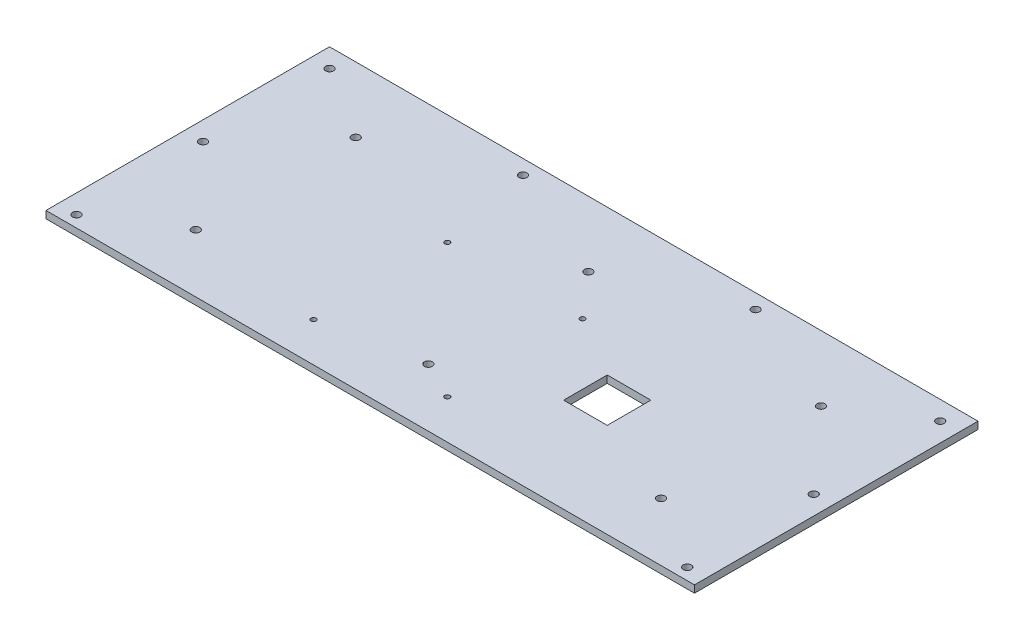
ISO-10303-21;
HEADER;
FILE_DESCRIPTION(('STEP AP214'),'2;1');
FILE_NAME('part.step','',(''),(''),'','','');
FILE_SCHEMA(('AUTOMOTIVE_DESIGN { 1 0 10303 214 1 1 1 1 }'));
ENDSEC;
DATA;
#1=APPLICATION_CONTEXT('core data for automotive mechanical design processes');
#2=APPLICATION_PROTOCOL_DEFINITION('international standard','automotive_design',2000,#1);
#3=PRODUCT_CONTEXT('',#1,'mechanical');
#4=PRODUCT('Part','Part','',(#3));
#5=PRODUCT_RELATED_PRODUCT_CATEGORY('part','',(#4));
#6=PRODUCT_DEFINITION_FORMATION('','',#4);
#7=PRODUCT_DEFINITION_CONTEXT('part definition',#1,'design');
#8=PRODUCT_DEFINITION('design','',#6,#7);
#9=PRODUCT_DEFINITION_SHAPE('','',#8);
#10=(LENGTH_UNIT() NAMED_UNIT(*) SI_UNIT(.MILLI.,.METRE.));
#11=(NAMED_UNIT(*) PLANE_ANGLE_UNIT() SI_UNIT($,.RADIAN.));
#12=(NAMED_UNIT(*) SI_UNIT($,.STERADIAN.) SOLID_ANGLE_UNIT());
#13=UNCERTAINTY_MEASURE_WITH_UNIT(LENGTH_MEASURE(1.E-05),#10,'distance_accuracy_value','');
#14=(GEOMETRIC_REPRESENTATION_CONTEXT(3) GLOBAL_UNCERTAINTY_ASSIGNED_CONTEXT((#13)) GLOBAL_UNIT_ASSIGNED_CONTEXT((#10,
#11,#12)) REPRESENTATION_CONTEXT('',''));
#15=CARTESIAN_POINT('',(0.,0.,0.));
#16=DIRECTION('',(0.,0.,1.));
#17=DIRECTION('',(1.,0.,0.));
#18=AXIS2_PLACEMENT_3D('',#15,#16,#17);
#19=CARTESIAN_POINT('',(0.,5.,0.));
#20=DIRECTION('',(0.,-1.,0.));
#21=DIRECTION('',(0.,0.,-1.));
#22=AXIS2_PLACEMENT_3D('',#19,#20,#21);
#23=PLANE('',#22);
#24=CARTESIAN_POINT('',(210.,5.,-84.5));
#25=DIRECTION('',(0.,1.,0.));
#26=DIRECTION('',(0.,0.,1.));
#27=AXIS2_PLACEMENT_3D('',#24,#25,#26);
#28=CIRCLE('',#27,2.75);
#29=CARTESIAN_POINT('',(210.,5.,-81.75));
#30=VERTEX_POINT('',#29);
#31=EDGE_CURVE('E126',#30,#30,#28,.T.);
#32=ORIENTED_EDGE('',*,*,#31,.F.);
#33=EDGE_LOOP('',(#32));
#34=FACE_BOUND('',#33,.T.);
#35=CARTESIAN_POINT('',(80.,5.,-87.5));
#36=DIRECTION('',(0.,1.,0.));
#37=DIRECTION('',(0.,0.,1.));
#38=AXIS2_PLACEMENT_3D('',#35,#36,#37);
#39=CIRCLE('',#38,2.75);
#40=CARTESIAN_POINT('',(80.,5.,-84.75));
#41=VERTEX_POINT('',#40);
#42=EDGE_CURVE('E132',#41,#41,#39,.T.);
#43=ORIENTED_EDGE('',*,*,#42,.F.);
#44=EDGE_LOOP('',(#43));
#45=FACE_BOUND('',#44,.T.);
#46=CARTESIAN_POINT('',(-80.,5.,-87.5));
#47=DIRECTION('',(0.,1.,0.));
#48=DIRECTION('',(0.,0.,1.));
#49=AXIS2_PLACEMENT_3D('',#46,#47,#48);
#50=CIRCLE('',#49,2.75);
#51=CARTESIAN_POINT('',(-80.,5.,-84.75));
#52=VERTEX_POINT('',#51);
#53=EDGE_CURVE('E106',#52,#52,#50,.T.);
#54=ORIENTED_EDGE('',*,*,#53,.F.);
#55=EDGE_LOOP('',(#54));
#56=FACE_BOUND('',#55,.T.);
#57=DIRECTION('',(1.,0.,0.));
#58=VECTOR('',#57,1.);
#59=CARTESIAN_POINT('',(68.,5.,32.5));
#60=LINE('',#59,#58);
#61=CARTESIAN_POINT('',(68.,5.,32.5));
#62=VERTEX_POINT('',#61);
#63=CARTESIAN_POINT('',(98.,5.,32.5));
#64=VERTEX_POINT('',#63);
#65=EDGE_CURVE('E112',#62,#64,#60,.T.);
#66=ORIENTED_EDGE('',*,*,#65,.F.);
#67=DIRECTION('',(0.,0.,1.));
#68=VECTOR('',#67,1.);
#69=CARTESIAN_POINT('',(68.,5.,2.5));
#70=LINE('',#69,#68);
#71=CARTESIAN_POINT('',(68.,5.,2.5));
#72=VERTEX_POINT('',#71);
#73=EDGE_CURVE('E32',#72,#62,#70,.T.);
#74=ORIENTED_EDGE('',*,*,#73,.F.);
#75=DIRECTION('',(-1.,0.,0.));
#76=VECTOR('',#75,1.);
#77=CARTESIAN_POINT('',(68.,5.,2.5));
#78=LINE('',#77,#76);
#79=CARTESIAN_POINT('',(98.,5.,2.5));
#80=VERTEX_POINT('',#79);
#81=EDGE_CURVE('E100',#80,#72,#78,.T.);
#82=ORIENTED_EDGE('',*,*,#81,.F.);
#83=DIRECTION('',(0.,0.,-1.));
#84=VECTOR('',#83,1.);
#85=CARTESIAN_POINT('',(98.,5.,2.5));
#86=LINE('',#85,#84);
#87=EDGE_CURVE('E103',#64,#80,#86,.T.);
#88=ORIENTED_EDGE('',*,*,#87,.F.);
#89=EDGE_LOOP('',(#66,#74,#82,#88));
#90=FACE_BOUND('',#89,.T.);
#91=CARTESIAN_POINT('',(210.,5.,2.5));
#92=DIRECTION('',(0.,1.,0.));
#93=DIRECTION('',(0.,0.,1.));
#94=AXIS2_PLACEMENT_3D('',#91,#92,#93);
#95=CIRCLE('',#94,2.75);
#96=CARTESIAN_POINT('',(210.,5.,5.25));
#97=VERTEX_POINT('',#96);
#98=EDGE_CURVE('E125',#97,#97,#95,.T.);
#99=ORIENTED_EDGE('',*,*,#98,.F.);
#100=EDGE_LOOP('',(#99));
#101=FACE_BOUND('',#100,.T.);
#102=CARTESIAN_POINT('',(210.,5.,89.5));
#103=DIRECTION('',(0.,1.,0.));
#104=DIRECTION('',(0.,0.,1.));
#105=AXIS2_PLACEMENT_3D('',#102,#103,#104);
#106=CIRCLE('',#105,2.75);
#107=CARTESIAN_POINT('',(210.,5.,92.25));
#108=VERTEX_POINT('',#107);
#109=EDGE_CURVE('E152',#108,#108,#106,.T.);
#110=ORIENTED_EDGE('',*,*,#109,.F.);
#111=EDGE_LOOP('',(#110));
#112=FACE_BOUND('',#111,.T.);
#113=CARTESIAN_POINT('',(-210.,5.,89.5));
#114=DIRECTION('',(0.,1.,0.));
#115=DIRECTION('',(0.,0.,1.));
#116=AXIS2_PLACEMENT_3D('',#113,#114,#115);
#117=CIRCLE('',#116,2.75);
#118=CARTESIAN_POINT('',(-210.,5.,92.25));
#119=VERTEX_POINT('',#118);
#120=EDGE_CURVE('E146',#119,#119,#117,.T.);
#121=ORIENTED_EDGE('',*,*,#120,.F.);
#122=EDGE_LOOP('',(#121));
#123=FACE_BOUND('',#122,.T.);
#124=CARTESIAN_POINT('',(-210.,5.,2.5));
#125=DIRECTION('',(0.,1.,0.));
#126=DIRECTION('',(0.,0.,1.));
#127=AXIS2_PLACEMENT_3D('',#124,#125,#126);
#128=CIRCLE('',#127,2.75);
#129=CARTESIAN_POINT('',(-210.,5.,5.25));
#130=VERTEX_POINT('',#129);
#131=EDGE_CURVE('E140',#130,#130,#128,.T.);
#132=ORIENTED_EDGE('',*,*,#131,.F.);
#133=EDGE_LOOP('',(#132));
#134=FACE_BOUND('',#133,.T.);
#135=CARTESIAN_POINT('',(160.,5.,57.5));
#136=DIRECTION('',(0.,1.,0.));
#137=DIRECTION('',(0.,0.,1.));
#138=AXIS2_PLACEMENT_3D('',#135,#136,#137);
#139=CIRCLE('',#138,2.75000000000004);
#140=CARTESIAN_POINT('',(160.,5.,60.25));
#141=VERTEX_POINT('',#140);
#142=EDGE_CURVE('E376',#141,#141,#139,.T.);
#143=ORIENTED_EDGE('',*,*,#142,.F.);
#144=EDGE_LOOP('',(#143));
#145=FACE_BOUND('',#144,.T.);
#146=CARTESIAN_POINT('',(0.,5.,57.5));
#147=DIRECTION('',(0.,1.,0.));
#148=DIRECTION('',(0.,0.,1.));
#149=AXIS2_PLACEMENT_3D('',#146,#147,#148);
#150=CIRCLE('',#149,2.75);
#151=CARTESIAN_POINT('',(0.,5.,60.25));
#152=VERTEX_POINT('',#151);
#153=EDGE_CURVE('E369',#152,#152,#150,.T.);
#154=ORIENTED_EDGE('',*,*,#153,.F.);
#155=EDGE_LOOP('',(#154));
#156=FACE_BOUND('',#155,.T.);
#157=CARTESIAN_POINT('',(-160.,5.,-52.5));
#158=DIRECTION('',(0.,1.,0.));
#159=DIRECTION('',(0.,0.,1.));
#160=AXIS2_PLACEMENT_3D('',#157,#158,#159);
#161=CIRCLE('',#160,2.75);
#162=CARTESIAN_POINT('',(-160.,5.,-49.75));
#163=VERTEX_POINT('',#162);
#164=EDGE_CURVE('E395',#163,#163,#161,.T.);
#165=ORIENTED_EDGE('',*,*,#164,.F.);
#166=EDGE_LOOP('',(#165));
#167=FACE_BOUND('',#166,.T.);
#168=CARTESIAN_POINT('',(0.,5.,-52.5));
#169=DIRECTION('',(0.,1.,0.));
#170=DIRECTION('',(0.,0.,1.));
#171=AXIS2_PLACEMENT_3D('',#168,#169,#170);
#172=CIRCLE('',#171,2.75);
#173=CARTESIAN_POINT('',(0.,5.,-49.75));
#174=VERTEX_POINT('',#173);
#175=EDGE_CURVE('E384',#174,#174,#172,.T.);
#176=ORIENTED_EDGE('',*,*,#175,.F.);
#177=EDGE_LOOP('',(#176));
#178=FACE_BOUND('',#177,.T.);
#179=CARTESIAN_POINT('',(160.,5.,-52.5));
#180=DIRECTION('',(0.,1.,0.));
#181=DIRECTION('',(0.,0.,1.));
#182=AXIS2_PLACEMENT_3D('',#179,#180,#181);
#183=CIRCLE('',#182,2.75);
#184=CARTESIAN_POINT('',(160.,5.,-49.75));
#185=VERTEX_POINT('',#184);
#186=EDGE_CURVE('E385',#185,#185,#183,.T.);
#187=ORIENTED_EDGE('',*,*,#186,.F.);
#188=EDGE_LOOP('',(#187));
#189=FACE_BOUND('',#188,.T.);
#190=CARTESIAN_POINT('',(-160.,5.,57.5));
#191=DIRECTION('',(0.,1.,0.));
#192=DIRECTION('',(0.,0.,1.));
#193=AXIS2_PLACEMENT_3D('',#190,#191,#192);
#194=CIRCLE('',#193,2.75);
#195=CARTESIAN_POINT('',(-160.,5.,60.25));
#196=VERTEX_POINT('',#195);
#197=EDGE_CURVE('E373',#196,#196,#194,.T.);
#198=ORIENTED_EDGE('',*,*,#197,.F.);
#199=EDGE_LOOP('',(#198));
#200=FACE_BOUND('',#199,.T.);
#201=CARTESIAN_POINT('',(-210.,5.,-84.5));
#202=DIRECTION('',(0.,1.,0.));
#203=DIRECTION('',(0.,0.,1.));
#204=AXIS2_PLACEMENT_3D('',#201,#202,#203);
#205=CIRCLE('',#204,2.75);
#206=CARTESIAN_POINT('',(-210.,5.,-81.75));
#207=VERTEX_POINT('',#206);
#208=EDGE_CURVE('E139',#207,#207,#205,.T.);
#209=ORIENTED_EDGE('',*,*,#208,.F.);
#210=EDGE_LOOP('',(#209));
#211=FACE_BOUND('',#210,.T.);
#212=DIRECTION('',(0.,0.,1.));
#213=VECTOR('',#212,1.);
#214=CARTESIAN_POINT('',(-223.,5.,-97.5));
#215=LINE('',#214,#213);
#216=CARTESIAN_POINT('',(-223.,5.,-97.5));
#217=VERTEX_POINT('',#216);
#218=CARTESIAN_POINT('',(-223.,5.,97.5));
#219=VERTEX_POINT('',#218);
#220=EDGE_CURVE('E190',#217,#219,#215,.T.);
#221=ORIENTED_EDGE('',*,*,#220,.T.);
#222=DIRECTION('',(1.,0.,0.));
#223=VECTOR('',#222,1.);
#224=CARTESIAN_POINT('',(223.,5.,97.5));
#225=LINE('',#224,#223);
#226=CARTESIAN_POINT('',(223.,5.,97.5));
#227=VERTEX_POINT('',#226);
#228=EDGE_CURVE('E193',#219,#227,#225,.T.);
#229=ORIENTED_EDGE('',*,*,#228,.T.);
#230=DIRECTION('',(0.,0.,-1.));
#231=VECTOR('',#230,1.);
#232=CARTESIAN_POINT('',(223.,5.,-97.5));
#233=LINE('',#232,#231);
#234=CARTESIAN_POINT('',(223.,5.,-97.5));
#235=VERTEX_POINT('',#234);
#236=EDGE_CURVE('E196',#227,#235,#233,.T.);
#237=ORIENTED_EDGE('',*,*,#236,.T.);
#238=DIRECTION('',(-1.,0.,0.));
#239=VECTOR('',#238,1.);
#240=CARTESIAN_POINT('',(223.,5.,-97.5));
#241=LINE('',#240,#239);
#242=EDGE_CURVE('E198',#235,#217,#241,.T.);
#243=ORIENTED_EDGE('',*,*,#242,.T.);
#244=EDGE_LOOP('',(#221,#229,#237,#243));
#245=FACE_BOUND('',#244,.T.);
#246=CARTESIAN_POINT('',(26.0054349448897,5.,70.5000001605361));
#247=DIRECTION('',(0.,1.,0.));
#248=DIRECTION('',(0.,0.,1.));
#249=AXIS2_PLACEMENT_3D('',#246,#247,#248);
#250=CIRCLE('',#249,1.75);
#251=CARTESIAN_POINT('',(26.0054349448897,5.,72.2500001605361));
#252=VERTEX_POINT('',#251);
#253=EDGE_CURVE('E184',#252,#252,#250,.T.);
#254=ORIENTED_EDGE('',*,*,#253,.F.);
#255=EDGE_LOOP('',(#254));
#256=FACE_BOUND('',#255,.T.);
#257=CARTESIAN_POINT('',(-66.,5.,70.5));
#258=DIRECTION('',(0.,1.,0.));
#259=DIRECTION('',(0.,0.,1.));
#260=AXIS2_PLACEMENT_3D('',#257,#258,#259);
#261=CIRCLE('',#260,1.75);
#262=CARTESIAN_POINT('',(-66.,5.,72.25));
#263=VERTEX_POINT('',#262);
#264=EDGE_CURVE('E178',#263,#263,#261,.T.);
#265=ORIENTED_EDGE('',*,*,#264,.F.);
#266=EDGE_LOOP('',(#265));
#267=FACE_BOUND('',#266,.T.);
#268=CARTESIAN_POINT('',(26.,5.,-22.5));
#269=DIRECTION('',(0.,1.,0.));
#270=DIRECTION('',(0.,0.,1.));
#271=AXIS2_PLACEMENT_3D('',#268,#269,#270);
#272=CIRCLE('',#271,1.75);
#273=CARTESIAN_POINT('',(26.,5.,-20.75));
#274=VERTEX_POINT('',#273);
#275=EDGE_CURVE('E172',#274,#274,#272,.T.);
#276=ORIENTED_EDGE('',*,*,#275,.F.);
#277=EDGE_LOOP('',(#276));
#278=FACE_BOUND('',#277,.T.);
#279=CARTESIAN_POINT('',(-65.9945650551103,5.,-21.4999998394639));
#280=DIRECTION('',(0.,1.,0.));
#281=DIRECTION('',(0.,0.,1.));
#282=AXIS2_PLACEMENT_3D('',#279,#280,#281);
#283=CIRCLE('',#282,1.75);
#284=CARTESIAN_POINT('',(-65.9945650551103,5.,-19.7499998394639));
#285=VERTEX_POINT('',#284);
#286=EDGE_CURVE('E166',#285,#285,#283,.T.);
#287=ORIENTED_EDGE('',*,*,#286,.F.);
#288=EDGE_LOOP('',(#287));
#289=FACE_BOUND('',#288,.T.);
#290=ADVANCED_FACE('F17',(#34,#45,#56,#90,#101,#112,#123,#134,#145,#156,#167,#178,#189,#200,
#211,#245,#256,#267,#278,#289),#23,.F.);
#291=CARTESIAN_POINT('',(0.,0.,0.));
#292=DIRECTION('',(0.,-1.,0.));
#293=DIRECTION('',(0.,0.,-1.));
#294=AXIS2_PLACEMENT_3D('',#291,#292,#293);
#295=PLANE('',#294);
#296=CARTESIAN_POINT('',(210.,0.,-84.5));
#297=DIRECTION('',(0.,1.,0.));
#298=DIRECTION('',(0.,0.,1.));
#299=AXIS2_PLACEMENT_3D('',#296,#297,#298);
#300=CIRCLE('',#299,2.75);
#301=CARTESIAN_POINT('',(210.,0.,-81.75));
#302=VERTEX_POINT('',#301);
#303=EDGE_CURVE('E122',#302,#302,#300,.T.);
#304=ORIENTED_EDGE('',*,*,#303,.T.);
#305=EDGE_LOOP('',(#304));
#306=FACE_BOUND('',#305,.T.);
#307=CARTESIAN_POINT('',(80.,0.,-87.5));
#308=DIRECTION('',(0.,1.,0.));
#309=DIRECTION('',(0.,0.,1.));
#310=AXIS2_PLACEMENT_3D('',#307,#308,#309);
#311=CIRCLE('',#310,2.75);
#312=CARTESIAN_POINT('',(80.,0.,-84.75));
#313=VERTEX_POINT('',#312);
#314=EDGE_CURVE('E129',#313,#313,#311,.T.);
#315=ORIENTED_EDGE('',*,*,#314,.T.);
#316=EDGE_LOOP('',(#315));
#317=FACE_BOUND('',#316,.T.);
#318=CARTESIAN_POINT('',(-80.,0.,-87.5));
#319=DIRECTION('',(0.,1.,0.));
#320=DIRECTION('',(0.,0.,1.));
#321=AXIS2_PLACEMENT_3D('',#318,#319,#320);
#322=CIRCLE('',#321,2.75);
#323=CARTESIAN_POINT('',(-80.,0.,-84.75));
#324=VERTEX_POINT('',#323);
#325=EDGE_CURVE('E135',#324,#324,#322,.T.);
#326=ORIENTED_EDGE('',*,*,#325,.T.);
#327=EDGE_LOOP('',(#326));
#328=FACE_BOUND('',#327,.T.);
#329=DIRECTION('',(0.,0.,1.));
#330=VECTOR('',#329,1.);
#331=CARTESIAN_POINT('',(68.,0.,2.5));
#332=LINE('',#331,#330);
#333=CARTESIAN_POINT('',(68.,0.,2.5));
#334=VERTEX_POINT('',#333);
#335=CARTESIAN_POINT('',(68.,0.,32.5));
#336=VERTEX_POINT('',#335);
#337=EDGE_CURVE('E84',#334,#336,#332,.T.);
#338=ORIENTED_EDGE('',*,*,#337,.T.);
#339=DIRECTION('',(1.,0.,0.));
#340=VECTOR('',#339,1.);
#341=CARTESIAN_POINT('',(68.,0.,32.5));
#342=LINE('',#341,#340);
#343=CARTESIAN_POINT('',(98.,0.,32.5));
#344=VERTEX_POINT('',#343);
#345=EDGE_CURVE('E93',#336,#344,#342,.T.);
#346=ORIENTED_EDGE('',*,*,#345,.T.);
#347=DIRECTION('',(0.,0.,-1.));
#348=VECTOR('',#347,1.);
#349=CARTESIAN_POINT('',(98.,0.,2.5));
#350=LINE('',#349,#348);
#351=CARTESIAN_POINT('',(98.,0.,2.5));
#352=VERTEX_POINT('',#351);
#353=EDGE_CURVE('E40',#344,#352,#350,.T.);
#354=ORIENTED_EDGE('',*,*,#353,.T.);
#355=DIRECTION('',(-1.,0.,0.));
#356=VECTOR('',#355,1.);
#357=CARTESIAN_POINT('',(68.,0.,2.5));
#358=LINE('',#357,#356);
#359=EDGE_CURVE('E90',#352,#334,#358,.T.);
#360=ORIENTED_EDGE('',*,*,#359,.T.);
#361=EDGE_LOOP('',(#338,#346,#354,#360));
#362=FACE_BOUND('',#361,.T.);
#363=CARTESIAN_POINT('',(210.,0.,2.5));
#364=DIRECTION('',(0.,1.,0.));
#365=DIRECTION('',(0.,0.,1.));
#366=AXIS2_PLACEMENT_3D('',#363,#364,#365);
#367=CIRCLE('',#366,2.75);
#368=CARTESIAN_POINT('',(210.,0.,5.25));
#369=VERTEX_POINT('',#368);
#370=EDGE_CURVE('E155',#369,#369,#367,.T.);
#371=ORIENTED_EDGE('',*,*,#370,.T.);
#372=EDGE_LOOP('',(#371));
#373=FACE_BOUND('',#372,.T.);
#374=CARTESIAN_POINT('',(210.,0.,89.5));
#375=DIRECTION('',(0.,1.,0.));
#376=DIRECTION('',(0.,0.,1.));
#377=AXIS2_PLACEMENT_3D('',#374,#375,#376);
#378=CIRCLE('',#377,2.75);
#379=CARTESIAN_POINT('',(210.,0.,92.25));
#380=VERTEX_POINT('',#379);
#381=EDGE_CURVE('E149',#380,#380,#378,.T.);
#382=ORIENTED_EDGE('',*,*,#381,.T.);
#383=EDGE_LOOP('',(#382));
#384=FACE_BOUND('',#383,.T.);
#385=CARTESIAN_POINT('',(-210.,0.,89.5));
#386=DIRECTION('',(0.,1.,0.));
#387=DIRECTION('',(0.,0.,1.));
#388=AXIS2_PLACEMENT_3D('',#385,#386,#387);
#389=CIRCLE('',#388,2.75);
#390=CARTESIAN_POINT('',(-210.,0.,92.25));
#391=VERTEX_POINT('',#390);
#392=EDGE_CURVE('E143',#391,#391,#389,.T.);
#393=ORIENTED_EDGE('',*,*,#392,.T.);
#394=EDGE_LOOP('',(#393));
#395=FACE_BOUND('',#394,.T.);
#396=CARTESIAN_POINT('',(-210.,0.,2.5));
#397=DIRECTION('',(0.,1.,0.));
#398=DIRECTION('',(0.,0.,1.));
#399=AXIS2_PLACEMENT_3D('',#396,#397,#398);
#400=CIRCLE('',#399,2.75);
#401=CARTESIAN_POINT('',(-210.,0.,5.25));
#402=VERTEX_POINT('',#401);
#403=EDGE_CURVE('E136',#402,#402,#400,.T.);
#404=ORIENTED_EDGE('',*,*,#403,.T.);
#405=EDGE_LOOP('',(#404));
#406=FACE_BOUND('',#405,.T.);
#407=CARTESIAN_POINT('',(160.,0.,57.5));
#408=DIRECTION('',(0.,1.,0.));
#409=DIRECTION('',(0.,0.,1.));
#410=AXIS2_PLACEMENT_3D('',#407,#408,#409);
#411=CIRCLE('',#410,2.75000000000004);
#412=CARTESIAN_POINT('',(160.,0.,60.25));
#413=VERTEX_POINT('',#412);
#414=EDGE_CURVE('E371',#413,#413,#411,.T.);
#415=ORIENTED_EDGE('',*,*,#414,.T.);
#416=EDGE_LOOP('',(#415));
#417=FACE_BOUND('',#416,.T.);
#418=CARTESIAN_POINT('',(0.,0.,57.5));
#419=DIRECTION('',(0.,1.,0.));
#420=DIRECTION('',(0.,0.,1.));
#421=AXIS2_PLACEMENT_3D('',#418,#419,#420);
#422=CIRCLE('',#421,2.75);
#423=CARTESIAN_POINT('',(0.,0.,60.25));
#424=VERTEX_POINT('',#423);
#425=EDGE_CURVE('E366',#424,#424,#422,.T.);
#426=ORIENTED_EDGE('',*,*,#425,.T.);
#427=EDGE_LOOP('',(#426));
#428=FACE_BOUND('',#427,.T.);
#429=CARTESIAN_POINT('',(-160.,0.,-52.5));
#430=DIRECTION('',(0.,1.,0.));
#431=DIRECTION('',(0.,0.,1.));
#432=AXIS2_PLACEMENT_3D('',#429,#430,#431);
#433=CIRCLE('',#432,2.75);
#434=CARTESIAN_POINT('',(-160.,0.,-49.75));
#435=VERTEX_POINT('',#434);
#436=EDGE_CURVE('E113',#435,#435,#433,.T.);
#437=ORIENTED_EDGE('',*,*,#436,.T.);
#438=EDGE_LOOP('',(#437));
#439=FACE_BOUND('',#438,.T.);
#440=CARTESIAN_POINT('',(0.,0.,-52.5));
#441=DIRECTION('',(0.,1.,0.));
#442=DIRECTION('',(0.,0.,1.));
#443=AXIS2_PLACEMENT_3D('',#440,#441,#442);
#444=CIRCLE('',#443,2.75);
#445=CARTESIAN_POINT('',(0.,0.,-49.75));
#446=VERTEX_POINT('',#445);
#447=EDGE_CURVE('E398',#446,#446,#444,.T.);
#448=ORIENTED_EDGE('',*,*,#447,.T.);
#449=EDGE_LOOP('',(#448));
#450=FACE_BOUND('',#449,.T.);
#451=CARTESIAN_POINT('',(160.,0.,-52.5));
#452=DIRECTION('',(0.,1.,0.));
#453=DIRECTION('',(0.,0.,1.));
#454=AXIS2_PLACEMENT_3D('',#451,#452,#453);
#455=CIRCLE('',#454,2.75);
#456=CARTESIAN_POINT('',(160.,0.,-49.75));
#457=VERTEX_POINT('',#456);
#458=EDGE_CURVE('E381',#457,#457,#455,.T.);
#459=ORIENTED_EDGE('',*,*,#458,.T.);
#460=EDGE_LOOP('',(#459));
#461=FACE_BOUND('',#460,.T.);
#462=CARTESIAN_POINT('',(-160.,0.,57.5));
#463=DIRECTION('',(0.,1.,0.));
#464=DIRECTION('',(0.,0.,1.));
#465=AXIS2_PLACEMENT_3D('',#462,#463,#464);
#466=CIRCLE('',#465,2.75);
#467=CARTESIAN_POINT('',(-160.,0.,60.25));
#468=VERTEX_POINT('',#467);
#469=EDGE_CURVE('E388',#468,#468,#466,.T.);
#470=ORIENTED_EDGE('',*,*,#469,.T.);
#471=EDGE_LOOP('',(#470));
#472=FACE_BOUND('',#471,.T.);
#473=CARTESIAN_POINT('',(-210.,0.,-84.5));
#474=DIRECTION('',(0.,1.,0.));
#475=DIRECTION('',(0.,0.,1.));
#476=AXIS2_PLACEMENT_3D('',#473,#474,#475);
#477=CIRCLE('',#476,2.75);
#478=CARTESIAN_POINT('',(-210.,0.,-81.75));
#479=VERTEX_POINT('',#478);
#480=EDGE_CURVE('E160',#479,#479,#477,.T.);
#481=ORIENTED_EDGE('',*,*,#480,.T.);
#482=EDGE_LOOP('',(#481));
#483=FACE_BOUND('',#482,.T.);
#484=CARTESIAN_POINT('',(26.,0.,-22.5));
#485=DIRECTION('',(0.,1.,0.));
#486=DIRECTION('',(0.,0.,1.));
#487=AXIS2_PLACEMENT_3D('',#484,#485,#486);
#488=CIRCLE('',#487,1.75);
#489=CARTESIAN_POINT('',(26.,0.,-20.75));
#490=VERTEX_POINT('',#489);
#491=EDGE_CURVE('E169',#490,#490,#488,.T.);
#492=ORIENTED_EDGE('',*,*,#491,.T.);
#493=EDGE_LOOP('',(#492));
#494=FACE_BOUND('',#493,.T.);
#495=CARTESIAN_POINT('',(26.0054349448897,0.,70.5000001605361));
#496=DIRECTION('',(0.,1.,0.));
#497=DIRECTION('',(0.,0.,1.));
#498=AXIS2_PLACEMENT_3D('',#495,#496,#497);
#499=CIRCLE('',#498,1.75);
#500=CARTESIAN_POINT('',(26.0054349448897,0.,72.2500001605361));
#501=VERTEX_POINT('',#500);
#502=EDGE_CURVE('E181',#501,#501,#499,.T.);
#503=ORIENTED_EDGE('',*,*,#502,.T.);
#504=EDGE_LOOP('',(#503));
#505=FACE_BOUND('',#504,.T.);
#506=DIRECTION('',(0.,0.,1.));
#507=VECTOR('',#506,1.);
#508=CARTESIAN_POINT('',(-223.,0.,-97.5));
#509=LINE('',#508,#507);
#510=CARTESIAN_POINT('',(-223.,0.,-97.5));
#511=VERTEX_POINT('',#510);
#512=CARTESIAN_POINT('',(-223.,0.,97.5));
#513=VERTEX_POINT('',#512);
#514=EDGE_CURVE('E187',#511,#513,#509,.T.);
#515=ORIENTED_EDGE('',*,*,#514,.F.);
#516=DIRECTION('',(-1.,0.,0.));
#517=VECTOR('',#516,1.);
#518=CARTESIAN_POINT('',(223.,0.,-97.5));
#519=LINE('',#518,#517);
#520=CARTESIAN_POINT('',(223.,0.,-97.5));
#521=VERTEX_POINT('',#520);
#522=EDGE_CURVE('E194',#521,#511,#519,.T.);
#523=ORIENTED_EDGE('',*,*,#522,.F.);
#524=DIRECTION('',(0.,0.,-1.));
#525=VECTOR('',#524,1.);
#526=CARTESIAN_POINT('',(223.,0.,-97.5));
#527=LINE('',#526,#525);
#528=CARTESIAN_POINT('',(223.,0.,97.5));
#529=VERTEX_POINT('',#528);
#530=EDGE_CURVE('E205',#529,#521,#527,.T.);
#531=ORIENTED_EDGE('',*,*,#530,.F.);
#532=DIRECTION('',(1.,0.,0.));
#533=VECTOR('',#532,1.);
#534=CARTESIAN_POINT('',(223.,0.,97.5));
#535=LINE('',#534,#533);
#536=EDGE_CURVE('E203',#513,#529,#535,.T.);
#537=ORIENTED_EDGE('',*,*,#536,.F.);
#538=EDGE_LOOP('',(#515,#523,#531,#537));
#539=FACE_BOUND('',#538,.T.);
#540=CARTESIAN_POINT('',(-66.,0.,70.5));
#541=DIRECTION('',(0.,1.,0.));
#542=DIRECTION('',(0.,0.,1.));
#543=AXIS2_PLACEMENT_3D('',#540,#541,#542);
#544=CIRCLE('',#543,1.75);
#545=CARTESIAN_POINT('',(-66.,0.,72.25));
#546=VERTEX_POINT('',#545);
#547=EDGE_CURVE('E175',#546,#546,#544,.T.);
#548=ORIENTED_EDGE('',*,*,#547,.T.);
#549=EDGE_LOOP('',(#548));
#550=FACE_BOUND('',#549,.T.);
#551=CARTESIAN_POINT('',(-65.9945650551103,0.,-21.4999998394639));
#552=DIRECTION('',(0.,1.,0.));
#553=DIRECTION('',(0.,0.,1.));
#554=AXIS2_PLACEMENT_3D('',#551,#552,#553);
#555=CIRCLE('',#554,1.75);
#556=CARTESIAN_POINT('',(-65.9945650551103,0.,-19.7499998394639));
#557=VERTEX_POINT('',#556);
#558=EDGE_CURVE('E163',#557,#557,#555,.T.);
#559=ORIENTED_EDGE('',*,*,#558,.T.);
#560=EDGE_LOOP('',(#559));
#561=FACE_BOUND('',#560,.T.);
#562=ADVANCED_FACE('F97',(#306,#317,#328,#362,#373,#384,#395,#406,#417,#428,#439,#450,#461,#472,
#483,#494,#505,#539,#550,#561),#295,.T.);
#563=CARTESIAN_POINT('',(-223.,5.,-97.5));
#564=DIRECTION('',(1.,0.,0.));
#565=DIRECTION('',(0.,0.,-1.));
#566=AXIS2_PLACEMENT_3D('',#563,#564,#565);
#567=PLANE('',#566);
#568=ORIENTED_EDGE('',*,*,#514,.T.);
#569=DIRECTION('',(0.,-1.,0.));
#570=VECTOR('',#569,1.);
#571=CARTESIAN_POINT('',(-223.,5.,97.5));
#572=LINE('',#571,#570);
#573=EDGE_CURVE('E11',#219,#513,#572,.T.);
#574=ORIENTED_EDGE('',*,*,#573,.F.);
#575=ORIENTED_EDGE('',*,*,#220,.F.);
#576=DIRECTION('',(0.,-1.,0.));
#577=VECTOR('',#576,1.);
#578=CARTESIAN_POINT('',(-223.,5.,-97.5));
#579=LINE('',#578,#577);
#580=EDGE_CURVE('E200',#217,#511,#579,.T.);
#581=ORIENTED_EDGE('',*,*,#580,.T.);
#582=EDGE_LOOP('',(#568,#574,#575,#581));
#583=FACE_BOUND('',#582,.T.);
#584=ADVANCED_FACE('F19',(#583),#567,.F.);
#585=CARTESIAN_POINT('',(223.,5.,97.5));
#586=DIRECTION('',(0.,0.,-1.));
#587=DIRECTION('',(-1.,0.,0.));
#588=AXIS2_PLACEMENT_3D('',#585,#586,#587);
#589=PLANE('',#588);
#590=ORIENTED_EDGE('',*,*,#536,.T.);
#591=DIRECTION('',(0.,-1.,0.));
#592=VECTOR('',#591,1.);
#593=CARTESIAN_POINT('',(223.,5.,97.5));
#594=LINE('',#593,#592);
#595=EDGE_CURVE('E25',#227,#529,#594,.T.);
#596=ORIENTED_EDGE('',*,*,#595,.F.);
#597=ORIENTED_EDGE('',*,*,#228,.F.);
#598=ORIENTED_EDGE('',*,*,#573,.T.);
#599=EDGE_LOOP('',(#590,#596,#597,#598));
#600=FACE_BOUND('',#599,.T.);
#601=ADVANCED_FACE('F233',(#600),#589,.F.);
#602=CARTESIAN_POINT('',(223.,5.,-97.5));
#603=DIRECTION('',(-1.,0.,0.));
#604=DIRECTION('',(0.,0.,1.));
#605=AXIS2_PLACEMENT_3D('',#602,#603,#604);
#606=PLANE('',#605);
#607=ORIENTED_EDGE('',*,*,#530,.T.);
#608=DIRECTION('',(0.,-1.,0.));
#609=VECTOR('',#608,1.);
#610=CARTESIAN_POINT('',(223.,5.,-97.5));
#611=LINE('',#610,#609);
#612=EDGE_CURVE('E210',#235,#521,#611,.T.);
#613=ORIENTED_EDGE('',*,*,#612,.F.);
#614=ORIENTED_EDGE('',*,*,#236,.F.);
#615=ORIENTED_EDGE('',*,*,#595,.T.);
#616=EDGE_LOOP('',(#607,#613,#614,#615));
#617=FACE_BOUND('',#616,.T.);
#618=ADVANCED_FACE('F217',(#617),#606,.F.);
#619=CARTESIAN_POINT('',(223.,5.,-97.5));
#620=DIRECTION('',(0.,0.,1.));
#621=DIRECTION('',(1.,0.,0.));
#622=AXIS2_PLACEMENT_3D('',#619,#620,#621);
#623=PLANE('',#622);
#624=ORIENTED_EDGE('',*,*,#522,.T.);
#625=ORIENTED_EDGE('',*,*,#580,.F.);
#626=ORIENTED_EDGE('',*,*,#242,.F.);
#627=ORIENTED_EDGE('',*,*,#612,.T.);
#628=EDGE_LOOP('',(#624,#625,#626,#627));
#629=FACE_BOUND('',#628,.T.);
#630=ADVANCED_FACE('F226',(#629),#623,.F.);
#631=CARTESIAN_POINT('',(26.0054349448897,5.,70.5000001605361));
#632=DIRECTION('',(0.,-1.,0.));
#633=DIRECTION('',(0.,0.,-1.));
#634=AXIS2_PLACEMENT_3D('',#631,#632,#633);
#635=CYLINDRICAL_SURFACE('',#634,1.75);
#636=ORIENTED_EDGE('',*,*,#253,.T.);
#637=EDGE_LOOP('',(#636));
#638=FACE_BOUND('',#637,.T.);
#639=ORIENTED_EDGE('',*,*,#502,.F.);
#640=EDGE_LOOP('',(#639));
#641=FACE_BOUND('',#640,.T.);
#642=ADVANCED_FACE('F254',(#638,#641),#635,.F.);
#643=CARTESIAN_POINT('',(-66.,5.,70.5));
#644=DIRECTION('',(0.,-1.,0.));
#645=DIRECTION('',(0.,0.,-1.));
#646=AXIS2_PLACEMENT_3D('',#643,#644,#645);
#647=CYLINDRICAL_SURFACE('',#646,1.75);
#648=ORIENTED_EDGE('',*,*,#264,.T.);
#649=EDGE_LOOP('',(#648));
#650=FACE_BOUND('',#649,.T.);
#651=ORIENTED_EDGE('',*,*,#547,.F.);
#652=EDGE_LOOP('',(#651));
#653=FACE_BOUND('',#652,.T.);
#654=ADVANCED_FACE('F262',(#650,#653),#647,.F.);
#655=CARTESIAN_POINT('',(26.,5.,-22.5));
#656=DIRECTION('',(0.,-1.,0.));
#657=DIRECTION('',(0.,0.,-1.));
#658=AXIS2_PLACEMENT_3D('',#655,#656,#657);
#659=CYLINDRICAL_SURFACE('',#658,1.75);
#660=ORIENTED_EDGE('',*,*,#275,.T.);
#661=EDGE_LOOP('',(#660));
#662=FACE_BOUND('',#661,.T.);
#663=ORIENTED_EDGE('',*,*,#491,.F.);
#664=EDGE_LOOP('',(#663));
#665=FACE_BOUND('',#664,.T.);
#666=ADVANCED_FACE('F268',(#662,#665),#659,.F.);
#667=CARTESIAN_POINT('',(-65.9945650551103,5.,-21.4999998394639));
#668=DIRECTION('',(0.,-1.,0.));
#669=DIRECTION('',(0.,0.,-1.));
#670=AXIS2_PLACEMENT_3D('',#667,#668,#669);
#671=CYLINDRICAL_SURFACE('',#670,1.75);
#672=ORIENTED_EDGE('',*,*,#286,.T.);
#673=EDGE_LOOP('',(#672));
#674=FACE_BOUND('',#673,.T.);
#675=ORIENTED_EDGE('',*,*,#558,.F.);
#676=EDGE_LOOP('',(#675));
#677=FACE_BOUND('',#676,.T.);
#678=ADVANCED_FACE('F281',(#674,#677),#671,.F.);
#679=CARTESIAN_POINT('',(-210.,0.,-84.5));
#680=DIRECTION('',(0.,1.,0.));
#681=DIRECTION('',(0.,0.,1.));
#682=AXIS2_PLACEMENT_3D('',#679,#680,#681);
#683=CYLINDRICAL_SURFACE('',#682,2.75);
#684=ORIENTED_EDGE('',*,*,#480,.F.);
#685=EDGE_LOOP('',(#684));
#686=FACE_BOUND('',#685,.T.);
#687=ORIENTED_EDGE('',*,*,#208,.T.);
#688=EDGE_LOOP('',(#687));
#689=FACE_BOUND('',#688,.T.);
#690=ADVANCED_FACE('F284',(#686,#689),#683,.F.);
#691=CARTESIAN_POINT('',(-160.,0.,57.5));
#692=DIRECTION('',(0.,1.,0.));
#693=DIRECTION('',(0.,0.,1.));
#694=AXIS2_PLACEMENT_3D('',#691,#692,#693);
#695=CYLINDRICAL_SURFACE('',#694,2.75);
#696=ORIENTED_EDGE('',*,*,#469,.F.);
#697=EDGE_LOOP('',(#696));
#698=FACE_BOUND('',#697,.T.);
#699=ORIENTED_EDGE('',*,*,#197,.T.);
#700=EDGE_LOOP('',(#699));
#701=FACE_BOUND('',#700,.T.);
#702=ADVANCED_FACE('F293',(#698,#701),#695,.F.);
#703=CARTESIAN_POINT('',(160.,0.,-52.5));
#704=DIRECTION('',(0.,1.,0.));
#705=DIRECTION('',(0.,0.,1.));
#706=AXIS2_PLACEMENT_3D('',#703,#704,#705);
#707=CYLINDRICAL_SURFACE('',#706,2.75);
#708=ORIENTED_EDGE('',*,*,#458,.F.);
#709=EDGE_LOOP('',(#708));
#710=FACE_BOUND('',#709,.T.);
#711=ORIENTED_EDGE('',*,*,#186,.T.);
#712=EDGE_LOOP('',(#711));
#713=FACE_BOUND('',#712,.T.);
#714=ADVANCED_FACE('F343',(#710,#713),#707,.F.);
#715=CARTESIAN_POINT('',(0.,0.,-52.5));
#716=DIRECTION('',(0.,1.,0.));
#717=DIRECTION('',(0.,0.,1.));
#718=AXIS2_PLACEMENT_3D('',#715,#716,#717);
#719=CYLINDRICAL_SURFACE('',#718,2.75);
#720=ORIENTED_EDGE('',*,*,#447,.F.);
#721=EDGE_LOOP('',(#720));
#722=FACE_BOUND('',#721,.T.);
#723=ORIENTED_EDGE('',*,*,#175,.T.);
#724=EDGE_LOOP('',(#723));
#725=FACE_BOUND('',#724,.T.);
#726=ADVANCED_FACE('F339',(#722,#725),#719,.F.);
#727=CARTESIAN_POINT('',(-160.,0.,-52.5));
#728=DIRECTION('',(0.,1.,0.));
#729=DIRECTION('',(0.,0.,1.));
#730=AXIS2_PLACEMENT_3D('',#727,#728,#729);
#731=CYLINDRICAL_SURFACE('',#730,2.75);
#732=ORIENTED_EDGE('',*,*,#436,.F.);
#733=EDGE_LOOP('',(#732));
#734=FACE_BOUND('',#733,.T.);
#735=ORIENTED_EDGE('',*,*,#164,.T.);
#736=EDGE_LOOP('',(#735));
#737=FACE_BOUND('',#736,.T.);
#738=ADVANCED_FACE('F342',(#734,#737),#731,.F.);
#739=CARTESIAN_POINT('',(0.,0.,57.5));
#740=DIRECTION('',(0.,1.,0.));
#741=DIRECTION('',(0.,0.,1.));
#742=AXIS2_PLACEMENT_3D('',#739,#740,#741);
#743=CYLINDRICAL_SURFACE('',#742,2.75);
#744=ORIENTED_EDGE('',*,*,#425,.F.);
#745=EDGE_LOOP('',(#744));
#746=FACE_BOUND('',#745,.T.);
#747=ORIENTED_EDGE('',*,*,#153,.T.);
#748=EDGE_LOOP('',(#747));
#749=FACE_BOUND('',#748,.T.);
#750=ADVANCED_FACE('F347',(#746,#749),#743,.F.);
#751=CARTESIAN_POINT('',(160.,0.,57.5));
#752=DIRECTION('',(0.,1.,0.));
#753=DIRECTION('',(0.,0.,1.));
#754=AXIS2_PLACEMENT_3D('',#751,#752,#753);
#755=CYLINDRICAL_SURFACE('',#754,2.75000000000004);
#756=ORIENTED_EDGE('',*,*,#414,.F.);
#757=EDGE_LOOP('',(#756));
#758=FACE_BOUND('',#757,.T.);
#759=ORIENTED_EDGE('',*,*,#142,.T.);
#760=EDGE_LOOP('',(#759));
#761=FACE_BOUND('',#760,.T.);
#762=ADVANCED_FACE('F314',(#758,#761),#755,.F.);
#763=CARTESIAN_POINT('',(-210.,0.,2.5));
#764=DIRECTION('',(0.,1.,0.));
#765=DIRECTION('',(0.,0.,1.));
#766=AXIS2_PLACEMENT_3D('',#763,#764,#765);
#767=CYLINDRICAL_SURFACE('',#766,2.75);
#768=ORIENTED_EDGE('',*,*,#403,.F.);
#769=EDGE_LOOP('',(#768));
#770=FACE_BOUND('',#769,.T.);
#771=ORIENTED_EDGE('',*,*,#131,.T.);
#772=EDGE_LOOP('',(#771));
#773=FACE_BOUND('',#772,.T.);
#774=ADVANCED_FACE('F310',(#770,#773),#767,.F.);
#775=CARTESIAN_POINT('',(-210.,0.,89.5));
#776=DIRECTION('',(0.,1.,0.));
#777=DIRECTION('',(0.,0.,1.));
#778=AXIS2_PLACEMENT_3D('',#775,#776,#777);
#779=CYLINDRICAL_SURFACE('',#778,2.75);
#780=ORIENTED_EDGE('',*,*,#392,.F.);
#781=EDGE_LOOP('',(#780));
#782=FACE_BOUND('',#781,.T.);
#783=ORIENTED_EDGE('',*,*,#120,.T.);
#784=EDGE_LOOP('',(#783));
#785=FACE_BOUND('',#784,.T.);
#786=ADVANCED_FACE('F306',(#782,#785),#779,.F.);
#787=CARTESIAN_POINT('',(210.,0.,89.5));
#788=DIRECTION('',(0.,1.,0.));
#789=DIRECTION('',(0.,0.,1.));
#790=AXIS2_PLACEMENT_3D('',#787,#788,#789);
#791=CYLINDRICAL_SURFACE('',#790,2.75);
#792=ORIENTED_EDGE('',*,*,#381,.F.);
#793=EDGE_LOOP('',(#792));
#794=FACE_BOUND('',#793,.T.);
#795=ORIENTED_EDGE('',*,*,#109,.T.);
#796=EDGE_LOOP('',(#795));
#797=FACE_BOUND('',#796,.T.);
#798=ADVANCED_FACE('F302',(#794,#797),#791,.F.);
#799=CARTESIAN_POINT('',(210.,0.,2.5));
#800=DIRECTION('',(0.,1.,0.));
#801=DIRECTION('',(0.,0.,1.));
#802=AXIS2_PLACEMENT_3D('',#799,#800,#801);
#803=CYLINDRICAL_SURFACE('',#802,2.75);
#804=ORIENTED_EDGE('',*,*,#370,.F.);
#805=EDGE_LOOP('',(#804));
#806=FACE_BOUND('',#805,.T.);
#807=ORIENTED_EDGE('',*,*,#98,.T.);
#808=EDGE_LOOP('',(#807));
#809=FACE_BOUND('',#808,.T.);
#810=ADVANCED_FACE('F299',(#806,#809),#803,.F.);
#811=CARTESIAN_POINT('',(68.,0.,2.5));
#812=DIRECTION('',(-1.,0.,0.));
#813=DIRECTION('',(0.,0.,1.));
#814=AXIS2_PLACEMENT_3D('',#811,#812,#813);
#815=PLANE('',#814);
#816=ORIENTED_EDGE('',*,*,#73,.T.);
#817=DIRECTION('',(0.,1.,0.));
#818=VECTOR('',#817,1.);
#819=CARTESIAN_POINT('',(68.,0.,32.5));
#820=LINE('',#819,#818);
#821=EDGE_CURVE('E80',#336,#62,#820,.T.);
#822=ORIENTED_EDGE('',*,*,#821,.F.);
#823=ORIENTED_EDGE('',*,*,#337,.F.);
#824=DIRECTION('',(0.,1.,0.));
#825=VECTOR('',#824,1.);
#826=CARTESIAN_POINT('',(68.,0.,2.5));
#827=LINE('',#826,#825);
#828=EDGE_CURVE('E117',#334,#72,#827,.T.);
#829=ORIENTED_EDGE('',*,*,#828,.T.);
#830=EDGE_LOOP('',(#816,#822,#823,#829));
#831=FACE_BOUND('',#830,.T.);
#832=ADVANCED_FACE('F82',(#831),#815,.F.);
#833=CARTESIAN_POINT('',(68.,0.,2.5));
#834=DIRECTION('',(0.,0.,-1.));
#835=DIRECTION('',(-1.,0.,0.));
#836=AXIS2_PLACEMENT_3D('',#833,#834,#835);
#837=PLANE('',#836);
#838=ORIENTED_EDGE('',*,*,#81,.T.);
#839=ORIENTED_EDGE('',*,*,#828,.F.);
#840=ORIENTED_EDGE('',*,*,#359,.F.);
#841=DIRECTION('',(0.,1.,0.));
#842=VECTOR('',#841,1.);
#843=CARTESIAN_POINT('',(98.,0.,2.5));
#844=LINE('',#843,#842);
#845=EDGE_CURVE('E119',#352,#80,#844,.T.);
#846=ORIENTED_EDGE('',*,*,#845,.T.);
#847=EDGE_LOOP('',(#838,#839,#840,#846));
#848=FACE_BOUND('',#847,.T.);
#849=ADVANCED_FACE('F327',(#848),#837,.F.);
#850=CARTESIAN_POINT('',(98.,0.,2.5));
#851=DIRECTION('',(1.,0.,0.));
#852=DIRECTION('',(0.,0.,-1.));
#853=AXIS2_PLACEMENT_3D('',#850,#851,#852);
#854=PLANE('',#853);
#855=ORIENTED_EDGE('',*,*,#87,.T.);
#856=ORIENTED_EDGE('',*,*,#845,.F.);
#857=ORIENTED_EDGE('',*,*,#353,.F.);
#858=DIRECTION('',(0.,1.,0.));
#859=VECTOR('',#858,1.);
#860=CARTESIAN_POINT('',(98.,0.,32.5));
#861=LINE('',#860,#859);
#862=EDGE_CURVE('E89',#344,#64,#861,.T.);
#863=ORIENTED_EDGE('',*,*,#862,.T.);
#864=EDGE_LOOP('',(#855,#856,#857,#863));
#865=FACE_BOUND('',#864,.T.);
#866=ADVANCED_FACE('F330',(#865),#854,.F.);
#867=CARTESIAN_POINT('',(68.,0.,32.5));
#868=DIRECTION('',(0.,0.,1.));
#869=DIRECTION('',(1.,0.,0.));
#870=AXIS2_PLACEMENT_3D('',#867,#868,#869);
#871=PLANE('',#870);
#872=ORIENTED_EDGE('',*,*,#65,.T.);
#873=ORIENTED_EDGE('',*,*,#862,.F.);
#874=ORIENTED_EDGE('',*,*,#345,.F.);
#875=ORIENTED_EDGE('',*,*,#821,.T.);
#876=EDGE_LOOP('',(#872,#873,#874,#875));
#877=FACE_BOUND('',#876,.T.);
#878=ADVANCED_FACE('F94',(#877),#871,.F.);
#879=CARTESIAN_POINT('',(-80.,0.,-87.5));
#880=DIRECTION('',(0.,1.,0.));
#881=DIRECTION('',(0.,0.,1.));
#882=AXIS2_PLACEMENT_3D('',#879,#880,#881);
#883=CYLINDRICAL_SURFACE('',#882,2.75);
#884=ORIENTED_EDGE('',*,*,#325,.F.);
#885=EDGE_LOOP('',(#884));
#886=FACE_BOUND('',#885,.T.);
#887=ORIENTED_EDGE('',*,*,#53,.T.);
#888=EDGE_LOOP('',(#887));
#889=FACE_BOUND('',#888,.T.);
#890=ADVANCED_FACE('F320',(#886,#889),#883,.F.);
#891=CARTESIAN_POINT('',(80.,0.,-87.5));
#892=DIRECTION('',(0.,1.,0.));
#893=DIRECTION('',(0.,0.,1.));
#894=AXIS2_PLACEMENT_3D('',#891,#892,#893);
#895=CYLINDRICAL_SURFACE('',#894,2.75);
#896=ORIENTED_EDGE('',*,*,#314,.F.);
#897=EDGE_LOOP('',(#896));
#898=FACE_BOUND('',#897,.T.);
#899=ORIENTED_EDGE('',*,*,#42,.T.);
#900=EDGE_LOOP('',(#899));
#901=FACE_BOUND('',#900,.T.);
#902=ADVANCED_FACE('F316',(#898,#901),#895,.F.);
#903=CARTESIAN_POINT('',(210.,0.,-84.5));
#904=DIRECTION('',(0.,1.,0.));
#905=DIRECTION('',(0.,0.,1.));
#906=AXIS2_PLACEMENT_3D('',#903,#904,#905);
#907=CYLINDRICAL_SURFACE('',#906,2.75);
#908=ORIENTED_EDGE('',*,*,#303,.F.);
#909=EDGE_LOOP('',(#908));
#910=FACE_BOUND('',#909,.T.);
#911=ORIENTED_EDGE('',*,*,#31,.T.);
#912=EDGE_LOOP('',(#911));
#913=FACE_BOUND('',#912,.T.);
#914=ADVANCED_FACE('F319',(#910,#913),#907,.F.);
#915=CLOSED_SHELL('',(#290,#562,#584,#601,#618,#630,#642,#654,#666,#678,#690,#702,#714,#726,
#738,#750,#762,#774,#786,#798,#810,#832,#849,#866,#878,#890,#902,#914));
#916=MANIFOLD_SOLID_BREP('B1',#915);
#917=ADVANCED_BREP_SHAPE_REPRESENTATION('',(#18,#916),#14);
#918=SHAPE_DEFINITION_REPRESENTATION(#9,#917);
ENDSEC;
END-ISO-10303-21;
